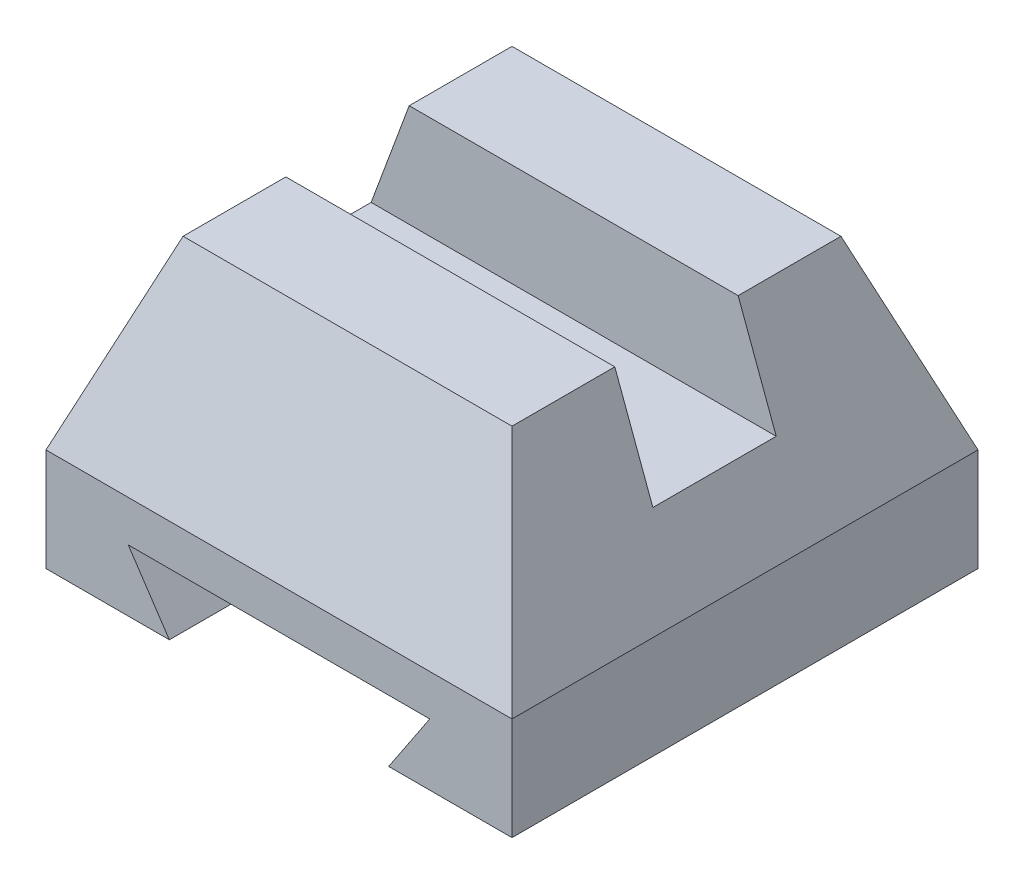
ISO-10303-21;
HEADER;
FILE_DESCRIPTION(('STEP AP214'),'2;1');
FILE_NAME('part.step','',(''),(''),'','','');
FILE_SCHEMA(('AUTOMOTIVE_DESIGN { 1 0 10303 214 1 1 1 1 }'));
ENDSEC;
DATA;
#1=APPLICATION_CONTEXT('core data for automotive mechanical design processes');
#2=APPLICATION_PROTOCOL_DEFINITION('international standard','automotive_design',2000,#1);
#3=PRODUCT_CONTEXT('',#1,'mechanical');
#4=PRODUCT('Part','Part','',(#3));
#5=PRODUCT_RELATED_PRODUCT_CATEGORY('part','',(#4));
#6=PRODUCT_DEFINITION_FORMATION('','',#4);
#7=PRODUCT_DEFINITION_CONTEXT('part definition',#1,'design');
#8=PRODUCT_DEFINITION('design','',#6,#7);
#9=PRODUCT_DEFINITION_SHAPE('','',#8);
#10=(LENGTH_UNIT() NAMED_UNIT(*) SI_UNIT(.MILLI.,.METRE.));
#11=(NAMED_UNIT(*) PLANE_ANGLE_UNIT() SI_UNIT($,.RADIAN.));
#12=(NAMED_UNIT(*) SI_UNIT($,.STERADIAN.) SOLID_ANGLE_UNIT());
#13=UNCERTAINTY_MEASURE_WITH_UNIT(LENGTH_MEASURE(1.E-05),#10,'distance_accuracy_value','');
#14=(GEOMETRIC_REPRESENTATION_CONTEXT(3) GLOBAL_UNCERTAINTY_ASSIGNED_CONTEXT((#13)) GLOBAL_UNIT_ASSIGNED_CONTEXT((#10,
#11,#12)) REPRESENTATION_CONTEXT('',''));
#15=CARTESIAN_POINT('',(0.,0.,0.));
#16=DIRECTION('',(0.,0.,1.));
#17=DIRECTION('',(1.,0.,0.));
#18=AXIS2_PLACEMENT_3D('',#15,#16,#17);
#19=CARTESIAN_POINT('',(34.,-6.,34.));
#20=DIRECTION('',(0.,1.,0.));
#21=DIRECTION('',(-1.,0.,0.));
#22=AXIS2_PLACEMENT_3D('',#19,#20,#21);
#23=PLANE('',#22);
#24=DIRECTION('',(0.,0.,1.));
#25=VECTOR('',#24,1.);
#26=CARTESIAN_POINT('',(-22.,-6.00000000000001,0.));
#27=LINE('',#26,#25);
#28=CARTESIAN_POINT('',(-22.,-6.,-34.));
#29=VERTEX_POINT('',#28);
#30=CARTESIAN_POINT('',(-22.,-6.,34.));
#31=VERTEX_POINT('',#30);
#32=EDGE_CURVE('E323',#29,#31,#27,.T.);
#33=ORIENTED_EDGE('',*,*,#32,.F.);
#34=DIRECTION('',(1.,0.,0.));
#35=VECTOR('',#34,1.);
#36=CARTESIAN_POINT('',(34.,-6.,-34.));
#37=LINE('',#36,#35);
#38=CARTESIAN_POINT('',(22.,-6.,-34.));
#39=VERTEX_POINT('',#38);
#40=EDGE_CURVE('E244',#29,#39,#37,.T.);
#41=ORIENTED_EDGE('',*,*,#40,.T.);
#42=DIRECTION('',(0.,0.,1.));
#43=VECTOR('',#42,1.);
#44=CARTESIAN_POINT('',(22.,-6.00000000000001,0.));
#45=LINE('',#44,#43);
#46=CARTESIAN_POINT('',(22.,-6.,34.));
#47=VERTEX_POINT('',#46);
#48=EDGE_CURVE('E353',#39,#47,#45,.T.);
#49=ORIENTED_EDGE('',*,*,#48,.T.);
#50=DIRECTION('',(1.,0.,0.));
#51=VECTOR('',#50,1.);
#52=CARTESIAN_POINT('',(34.,-6.,34.));
#53=LINE('',#52,#51);
#54=EDGE_CURVE('E352',#31,#47,#53,.T.);
#55=ORIENTED_EDGE('',*,*,#54,.F.);
#56=EDGE_LOOP('',(#33,#41,#49,#55));
#57=FACE_BOUND('',#56,.T.);
#58=ADVANCED_FACE('F47',(#57),#23,.F.);
#59=CARTESIAN_POINT('',(34.,0.,34.));
#60=DIRECTION('',(-1.,0.,0.));
#61=DIRECTION('',(0.,0.,1.));
#62=AXIS2_PLACEMENT_3D('',#59,#60,#61);
#63=PLANE('',#62);
#64=DIRECTION('',(0.,0.,1.));
#65=VECTOR('',#64,1.);
#66=CARTESIAN_POINT('',(34.,-15.,0.));
#67=LINE('',#66,#65);
#68=CARTESIAN_POINT('',(34.,-15.,-34.));
#69=VERTEX_POINT('',#68);
#70=CARTESIAN_POINT('',(34.,-15.,34.));
#71=VERTEX_POINT('',#70);
#72=EDGE_CURVE('E355',#69,#71,#67,.T.);
#73=ORIENTED_EDGE('',*,*,#72,.F.);
#74=DIRECTION('',(0.,1.,0.));
#75=VECTOR('',#74,1.);
#76=CARTESIAN_POINT('',(34.,0.,-34.));
#77=LINE('',#76,#75);
#78=CARTESIAN_POINT('',(34.,0.,-34.));
#79=VERTEX_POINT('',#78);
#80=EDGE_CURVE('E247',#69,#79,#77,.T.);
#81=ORIENTED_EDGE('',*,*,#80,.T.);
#82=DIRECTION('',(0.,0.,1.));
#83=VECTOR('',#82,1.);
#84=CARTESIAN_POINT('',(34.,0.,0.));
#85=LINE('',#84,#83);
#86=CARTESIAN_POINT('',(34.,0.,34.));
#87=VERTEX_POINT('',#86);
#88=EDGE_CURVE('E57',#87,#79,#85,.F.);
#89=ORIENTED_EDGE('',*,*,#88,.F.);
#90=DIRECTION('',(0.,1.,0.));
#91=VECTOR('',#90,1.);
#92=CARTESIAN_POINT('',(34.,0.,34.));
#93=LINE('',#92,#91);
#94=EDGE_CURVE('E354',#71,#87,#93,.T.);
#95=ORIENTED_EDGE('',*,*,#94,.F.);
#96=EDGE_LOOP('',(#73,#81,#89,#95));
#97=FACE_BOUND('',#96,.T.);
#98=ADVANCED_FACE('F435',(#97),#63,.F.);
#99=CARTESIAN_POINT('',(0.,0.,34.));
#100=DIRECTION('',(0.,0.,-1.));
#101=DIRECTION('',(-1.,0.,0.));
#102=AXIS2_PLACEMENT_3D('',#99,#100,#101);
#103=PLANE('',#102);
#104=DIRECTION('',(-1.,0.,0.));
#105=VECTOR('',#104,1.);
#106=CARTESIAN_POINT('',(0.,0.,34.));
#107=LINE('',#106,#105);
#108=CARTESIAN_POINT('',(-34.,0.,34.));
#109=VERTEX_POINT('',#108);
#110=EDGE_CURVE('E86',#87,#109,#107,.T.);
#111=ORIENTED_EDGE('',*,*,#110,.T.);
#112=DIRECTION('',(0.,1.,0.));
#113=VECTOR('',#112,1.);
#114=CARTESIAN_POINT('',(-34.,0.,34.));
#115=LINE('',#114,#113);
#116=CARTESIAN_POINT('',(-34.,-15.,34.));
#117=VERTEX_POINT('',#116);
#118=EDGE_CURVE('E312',#117,#109,#115,.T.);
#119=ORIENTED_EDGE('',*,*,#118,.F.);
#120=DIRECTION('',(-1.,0.,0.));
#121=VECTOR('',#120,1.);
#122=CARTESIAN_POINT('',(-34.,-15.,34.));
#123=LINE('',#122,#121);
#124=CARTESIAN_POINT('',(-16.,-15.,34.));
#125=VERTEX_POINT('',#124);
#126=EDGE_CURVE('E342',#125,#117,#123,.T.);
#127=ORIENTED_EDGE('',*,*,#126,.F.);
#128=DIRECTION('',(0.554700196225229,-0.832050294337844,0.));
#129=VECTOR('',#128,1.);
#130=CARTESIAN_POINT('',(-22.,-6.00000000000001,34.));
#131=LINE('',#130,#129);
#132=EDGE_CURVE('E339',#31,#125,#131,.T.);
#133=ORIENTED_EDGE('',*,*,#132,.F.);
#134=ORIENTED_EDGE('',*,*,#54,.T.);
#135=DIRECTION('',(-0.554700196225229,-0.832050294337844,0.));
#136=VECTOR('',#135,1.);
#137=CARTESIAN_POINT('',(22.,-6.00000000000001,34.));
#138=LINE('',#137,#136);
#139=CARTESIAN_POINT('',(16.,-15.,34.));
#140=VERTEX_POINT('',#139);
#141=EDGE_CURVE('E73',#47,#140,#138,.T.);
#142=ORIENTED_EDGE('',*,*,#141,.T.);
#143=DIRECTION('',(1.,0.,0.));
#144=VECTOR('',#143,1.);
#145=CARTESIAN_POINT('',(34.,-15.,34.));
#146=LINE('',#145,#144);
#147=EDGE_CURVE('E364',#140,#71,#146,.T.);
#148=ORIENTED_EDGE('',*,*,#147,.T.);
#149=ORIENTED_EDGE('',*,*,#94,.T.);
#150=EDGE_LOOP('',(#111,#119,#127,#133,#134,#142,#148,#149));
#151=FACE_BOUND('',#150,.T.);
#152=ADVANCED_FACE('F357',(#151),#103,.F.);
#153=CARTESIAN_POINT('',(34.,-15.,0.));
#154=DIRECTION('',(0.,-1.,0.));
#155=DIRECTION('',(1.,0.,0.));
#156=AXIS2_PLACEMENT_3D('',#153,#154,#155);
#157=PLANE('',#156);
#158=ORIENTED_EDGE('',*,*,#147,.F.);
#159=DIRECTION('',(0.,0.,1.));
#160=VECTOR('',#159,1.);
#161=CARTESIAN_POINT('',(16.,-15.,0.));
#162=LINE('',#161,#160);
#163=CARTESIAN_POINT('',(16.,-15.,-34.));
#164=VERTEX_POINT('',#163);
#165=EDGE_CURVE('E362',#164,#140,#162,.T.);
#166=ORIENTED_EDGE('',*,*,#165,.F.);
#167=DIRECTION('',(1.,0.,0.));
#168=VECTOR('',#167,1.);
#169=CARTESIAN_POINT('',(34.,-15.,-34.));
#170=LINE('',#169,#168);
#171=EDGE_CURVE('E241',#164,#69,#170,.T.);
#172=ORIENTED_EDGE('',*,*,#171,.T.);
#173=ORIENTED_EDGE('',*,*,#72,.T.);
#174=EDGE_LOOP('',(#158,#166,#172,#173));
#175=FACE_BOUND('',#174,.T.);
#176=ADVANCED_FACE('F432',(#175),#157,.T.);
#177=CARTESIAN_POINT('',(22.,-6.00000000000001,0.));
#178=DIRECTION('',(-0.832050294337844,0.554700196225229,0.));
#179=DIRECTION('',(-0.554700196225229,-0.832050294337844,0.));
#180=AXIS2_PLACEMENT_3D('',#177,#178,#179);
#181=PLANE('',#180);
#182=ORIENTED_EDGE('',*,*,#141,.F.);
#183=ORIENTED_EDGE('',*,*,#48,.F.);
#184=DIRECTION('',(-0.554700196225229,-0.832050294337844,0.));
#185=VECTOR('',#184,1.);
#186=CARTESIAN_POINT('',(22.,-6.00000000000001,-34.));
#187=LINE('',#186,#185);
#188=EDGE_CURVE('E233',#39,#164,#187,.T.);
#189=ORIENTED_EDGE('',*,*,#188,.T.);
#190=ORIENTED_EDGE('',*,*,#165,.T.);
#191=EDGE_LOOP('',(#182,#183,#189,#190));
#192=FACE_BOUND('',#191,.T.);
#193=ADVANCED_FACE('F361',(#192),#181,.T.);
#194=CARTESIAN_POINT('',(0.,27.,0.));
#195=DIRECTION('',(0.,1.,0.));
#196=DIRECTION('',(0.,0.,1.));
#197=AXIS2_PLACEMENT_3D('',#194,#195,#196);
#198=PLANE('',#197);
#199=DIRECTION('',(1.,0.,0.));
#200=VECTOR('',#199,1.);
#201=CARTESIAN_POINT('',(0.,27.,24.));
#202=LINE('',#201,#200);
#203=CARTESIAN_POINT('',(0.,27.,24.));
#204=VERTEX_POINT('',#203);
#205=CARTESIAN_POINT('',(24.,27.,24.));
#206=VERTEX_POINT('',#205);
#207=EDGE_CURVE('E384',#204,#206,#202,.T.);
#208=ORIENTED_EDGE('',*,*,#207,.T.);
#209=DIRECTION('',(0.,0.,-1.));
#210=VECTOR('',#209,1.);
#211=CARTESIAN_POINT('',(24.,27.,24.));
#212=LINE('',#211,#210);
#213=CARTESIAN_POINT('',(24.,27.,9.));
#214=VERTEX_POINT('',#213);
#215=EDGE_CURVE('E92',#206,#214,#212,.T.);
#216=ORIENTED_EDGE('',*,*,#215,.T.);
#217=DIRECTION('',(-1.,0.,0.));
#218=VECTOR('',#217,1.);
#219=CARTESIAN_POINT('',(24.,27.,9.));
#220=LINE('',#219,#218);
#221=CARTESIAN_POINT('',(-24.,27.,9.));
#222=VERTEX_POINT('',#221);
#223=EDGE_CURVE('E377',#214,#222,#220,.T.);
#224=ORIENTED_EDGE('',*,*,#223,.T.);
#225=DIRECTION('',(0.,0.,-1.));
#226=VECTOR('',#225,1.);
#227=CARTESIAN_POINT('',(-24.,27.,24.));
#228=LINE('',#227,#226);
#229=CARTESIAN_POINT('',(-24.,27.,24.));
#230=VERTEX_POINT('',#229);
#231=EDGE_CURVE('E329',#230,#222,#228,.T.);
#232=ORIENTED_EDGE('',*,*,#231,.F.);
#233=DIRECTION('',(-1.,0.,0.));
#234=VECTOR('',#233,1.);
#235=CARTESIAN_POINT('',(0.,27.,24.));
#236=LINE('',#235,#234);
#237=EDGE_CURVE('E332',#204,#230,#236,.T.);
#238=ORIENTED_EDGE('',*,*,#237,.F.);
#239=EDGE_LOOP('',(#208,#216,#224,#232,#238));
#240=FACE_BOUND('',#239,.T.);
#241=ADVANCED_FACE('F399',(#240),#198,.T.);
#242=CARTESIAN_POINT('',(0.,11.0735826296743,29.8986731001206));
#243=DIRECTION('',(0.,-0.347314355823594,-0.937748760723704));
#244=DIRECTION('',(0.,0.937748760723704,-0.347314355823594));
#245=AXIS2_PLACEMENT_3D('',#242,#243,#244);
#246=PLANE('',#245);
#247=ORIENTED_EDGE('',*,*,#207,.F.);
#248=ORIENTED_EDGE('',*,*,#237,.T.);
#249=DIRECTION('',(-0.328089357462393,-0.885841265148462,0.328089357462393));
#250=VECTOR('',#249,1.);
#251=CARTESIAN_POINT('',(-24.,27.,24.));
#252=LINE('',#251,#250);
#253=EDGE_CURVE('E309',#230,#109,#252,.T.);
#254=ORIENTED_EDGE('',*,*,#253,.T.);
#255=ORIENTED_EDGE('',*,*,#110,.F.);
#256=DIRECTION('',(0.328089357462393,-0.885841265148462,0.328089357462393));
#257=VECTOR('',#256,1.);
#258=CARTESIAN_POINT('',(24.,27.,24.));
#259=LINE('',#258,#257);
#260=EDGE_CURVE('E379',#206,#87,#259,.T.);
#261=ORIENTED_EDGE('',*,*,#260,.F.);
#262=EDGE_LOOP('',(#247,#248,#254,#255,#261));
#263=FACE_BOUND('',#262,.T.);
#264=ADVANCED_FACE('F409',(#263),#246,.F.);
#265=CARTESIAN_POINT('',(29.8986731001206,11.0735826296743,0.));
#266=DIRECTION('',(0.937748760723704,0.347314355823594,0.));
#267=DIRECTION('',(-0.347314355823594,0.937748760723704,0.));
#268=AXIS2_PLACEMENT_3D('',#265,#266,#267);
#269=PLANE('',#268);
#270=DIRECTION('',(0.347314355823594,-0.937748760723704,0.));
#271=VECTOR('',#270,1.);
#272=CARTESIAN_POINT('',(29.8986731001206,11.0735826296743,9.));
#273=LINE('',#272,#271);
#274=CARTESIAN_POINT('',(29.5555555555556,12.,9.));
#275=VERTEX_POINT('',#274);
#276=EDGE_CURVE('E12',#214,#275,#273,.T.);
#277=ORIENTED_EDGE('',*,*,#276,.F.);
#278=ORIENTED_EDGE('',*,*,#215,.F.);
#279=ORIENTED_EDGE('',*,*,#260,.T.);
#280=ORIENTED_EDGE('',*,*,#88,.T.);
#281=DIRECTION('',(0.328089357462393,-0.885841265148462,-0.328089357462393));
#282=VECTOR('',#281,1.);
#283=CARTESIAN_POINT('',(24.,27.,-24.));
#284=LINE('',#283,#282);
#285=CARTESIAN_POINT('',(24.,27.,-24.));
#286=VERTEX_POINT('',#285);
#287=EDGE_CURVE('E189',#286,#79,#284,.T.);
#288=ORIENTED_EDGE('',*,*,#287,.F.);
#289=DIRECTION('',(0.,0.,1.));
#290=VECTOR('',#289,1.);
#291=CARTESIAN_POINT('',(24.,27.,-24.));
#292=LINE('',#291,#290);
#293=CARTESIAN_POINT('',(24.,27.,-9.));
#294=VERTEX_POINT('',#293);
#295=EDGE_CURVE('E190',#286,#294,#292,.T.);
#296=ORIENTED_EDGE('',*,*,#295,.T.);
#297=DIRECTION('',(0.347314355823594,-0.937748760723704,0.));
#298=VECTOR('',#297,1.);
#299=CARTESIAN_POINT('',(29.8986731001206,11.0735826296743,-9.));
#300=LINE('',#299,#298);
#301=CARTESIAN_POINT('',(29.5555555555556,12.,-9.));
#302=VERTEX_POINT('',#301);
#303=EDGE_CURVE('E185',#294,#302,#300,.T.);
#304=ORIENTED_EDGE('',*,*,#303,.T.);
#305=DIRECTION('',(0.,0.,1.));
#306=VECTOR('',#305,1.);
#307=CARTESIAN_POINT('',(29.5555555555556,12.,-25.));
#308=LINE('',#307,#306);
#309=EDGE_CURVE('E65',#302,#275,#308,.T.);
#310=ORIENTED_EDGE('',*,*,#309,.T.);
#311=EDGE_LOOP('',(#277,#278,#279,#280,#288,#296,#304,#310));
#312=FACE_BOUND('',#311,.T.);
#313=ADVANCED_FACE('F436',(#312),#269,.T.);
#314=CARTESIAN_POINT('',(34.,0.,9.));
#315=DIRECTION('',(0.,0.,1.));
#316=DIRECTION('',(1.,0.,0.));
#317=AXIS2_PLACEMENT_3D('',#314,#315,#316);
#318=PLANE('',#317);
#319=ORIENTED_EDGE('',*,*,#276,.T.);
#320=DIRECTION('',(-1.,0.,0.));
#321=VECTOR('',#320,1.);
#322=CARTESIAN_POINT('',(34.,12.,9.));
#323=LINE('',#322,#321);
#324=CARTESIAN_POINT('',(-29.5555555555556,12.,9.));
#325=VERTEX_POINT('',#324);
#326=EDGE_CURVE('E453',#275,#325,#323,.T.);
#327=ORIENTED_EDGE('',*,*,#326,.T.);
#328=DIRECTION('',(-0.347314355823594,-0.937748760723704,0.));
#329=VECTOR('',#328,1.);
#330=CARTESIAN_POINT('',(-29.8986731001206,11.0735826296743,9.));
#331=LINE('',#330,#329);
#332=EDGE_CURVE('E311',#222,#325,#331,.T.);
#333=ORIENTED_EDGE('',*,*,#332,.F.);
#334=ORIENTED_EDGE('',*,*,#223,.F.);
#335=EDGE_LOOP('',(#319,#327,#333,#334));
#336=FACE_BOUND('',#335,.T.);
#337=ADVANCED_FACE('F410',(#336),#318,.F.);
#338=CARTESIAN_POINT('',(34.,12.,0.));
#339=DIRECTION('',(0.,1.,0.));
#340=DIRECTION('',(0.,0.,1.));
#341=AXIS2_PLACEMENT_3D('',#338,#339,#340);
#342=PLANE('',#341);
#343=ORIENTED_EDGE('',*,*,#309,.F.);
#344=DIRECTION('',(-1.,0.,0.));
#345=VECTOR('',#344,1.);
#346=CARTESIAN_POINT('',(34.,12.,-9.));
#347=LINE('',#346,#345);
#348=CARTESIAN_POINT('',(-29.5555555555556,12.,-9.));
#349=VERTEX_POINT('',#348);
#350=EDGE_CURVE('E179',#302,#349,#347,.T.);
#351=ORIENTED_EDGE('',*,*,#350,.T.);
#352=DIRECTION('',(0.,0.,1.));
#353=VECTOR('',#352,1.);
#354=CARTESIAN_POINT('',(-29.5555555555556,12.,-25.));
#355=LINE('',#354,#353);
#356=EDGE_CURVE('E175',#349,#325,#355,.T.);
#357=ORIENTED_EDGE('',*,*,#356,.T.);
#358=ORIENTED_EDGE('',*,*,#326,.F.);
#359=EDGE_LOOP('',(#343,#351,#357,#358));
#360=FACE_BOUND('',#359,.T.);
#361=ADVANCED_FACE('F500',(#360),#342,.T.);
#362=CARTESIAN_POINT('',(-34.,0.,34.));
#363=DIRECTION('',(1.,0.,0.));
#364=DIRECTION('',(0.,0.,1.));
#365=AXIS2_PLACEMENT_3D('',#362,#363,#364);
#366=PLANE('',#365);
#367=DIRECTION('',(0.,0.,1.));
#368=VECTOR('',#367,1.);
#369=CARTESIAN_POINT('',(-34.,0.,0.));
#370=LINE('',#369,#368);
#371=CARTESIAN_POINT('',(-34.,0.,-34.));
#372=VERTEX_POINT('',#371);
#373=EDGE_CURVE('E306',#109,#372,#370,.F.);
#374=ORIENTED_EDGE('',*,*,#373,.T.);
#375=DIRECTION('',(0.,1.,0.));
#376=VECTOR('',#375,1.);
#377=CARTESIAN_POINT('',(-34.,0.,-34.));
#378=LINE('',#377,#376);
#379=CARTESIAN_POINT('',(-34.,-15.,-34.));
#380=VERTEX_POINT('',#379);
#381=EDGE_CURVE('E180',#380,#372,#378,.T.);
#382=ORIENTED_EDGE('',*,*,#381,.F.);
#383=DIRECTION('',(0.,0.,1.));
#384=VECTOR('',#383,1.);
#385=CARTESIAN_POINT('',(-34.,-15.,0.));
#386=LINE('',#385,#384);
#387=EDGE_CURVE('E316',#380,#117,#386,.T.);
#388=ORIENTED_EDGE('',*,*,#387,.T.);
#389=ORIENTED_EDGE('',*,*,#118,.T.);
#390=EDGE_LOOP('',(#374,#382,#388,#389));
#391=FACE_BOUND('',#390,.T.);
#392=ADVANCED_FACE('F315',(#391),#366,.F.);
#393=CARTESIAN_POINT('',(-34.,-15.,0.));
#394=DIRECTION('',(0.,-1.,0.));
#395=DIRECTION('',(-1.,0.,0.));
#396=AXIS2_PLACEMENT_3D('',#393,#394,#395);
#397=PLANE('',#396);
#398=ORIENTED_EDGE('',*,*,#126,.T.);
#399=ORIENTED_EDGE('',*,*,#387,.F.);
#400=DIRECTION('',(-1.,0.,0.));
#401=VECTOR('',#400,1.);
#402=CARTESIAN_POINT('',(-34.,-15.,-34.));
#403=LINE('',#402,#401);
#404=CARTESIAN_POINT('',(-16.,-15.,-34.));
#405=VERTEX_POINT('',#404);
#406=EDGE_CURVE('E293',#405,#380,#403,.T.);
#407=ORIENTED_EDGE('',*,*,#406,.F.);
#408=DIRECTION('',(0.,0.,1.));
#409=VECTOR('',#408,1.);
#410=CARTESIAN_POINT('',(-16.,-15.,0.));
#411=LINE('',#410,#409);
#412=EDGE_CURVE('E320',#405,#125,#411,.T.);
#413=ORIENTED_EDGE('',*,*,#412,.T.);
#414=EDGE_LOOP('',(#398,#399,#407,#413));
#415=FACE_BOUND('',#414,.T.);
#416=ADVANCED_FACE('F358',(#415),#397,.T.);
#417=CARTESIAN_POINT('',(-22.,-6.00000000000001,0.));
#418=DIRECTION('',(0.832050294337844,0.554700196225229,0.));
#419=DIRECTION('',(0.554700196225229,-0.832050294337844,0.));
#420=AXIS2_PLACEMENT_3D('',#417,#418,#419);
#421=PLANE('',#420);
#422=ORIENTED_EDGE('',*,*,#132,.T.);
#423=ORIENTED_EDGE('',*,*,#412,.F.);
#424=DIRECTION('',(0.554700196225229,-0.832050294337844,0.));
#425=VECTOR('',#424,1.);
#426=CARTESIAN_POINT('',(-22.,-6.00000000000001,-34.));
#427=LINE('',#426,#425);
#428=EDGE_CURVE('E290',#29,#405,#427,.T.);
#429=ORIENTED_EDGE('',*,*,#428,.F.);
#430=ORIENTED_EDGE('',*,*,#32,.T.);
#431=EDGE_LOOP('',(#422,#423,#429,#430));
#432=FACE_BOUND('',#431,.T.);
#433=ADVANCED_FACE('F347',(#432),#421,.T.);
#434=CARTESIAN_POINT('',(-29.8986731001206,11.0735826296743,0.));
#435=DIRECTION('',(-0.937748760723704,0.347314355823594,0.));
#436=DIRECTION('',(0.347314355823594,0.937748760723704,0.));
#437=AXIS2_PLACEMENT_3D('',#434,#435,#436);
#438=PLANE('',#437);
#439=ORIENTED_EDGE('',*,*,#332,.T.);
#440=ORIENTED_EDGE('',*,*,#356,.F.);
#441=DIRECTION('',(-0.347314355823594,-0.937748760723704,0.));
#442=VECTOR('',#441,1.);
#443=CARTESIAN_POINT('',(-29.8986731001206,11.0735826296743,-9.));
#444=LINE('',#443,#442);
#445=CARTESIAN_POINT('',(-24.,27.,-9.));
#446=VERTEX_POINT('',#445);
#447=EDGE_CURVE('E165',#446,#349,#444,.T.);
#448=ORIENTED_EDGE('',*,*,#447,.F.);
#449=DIRECTION('',(0.,0.,1.));
#450=VECTOR('',#449,1.);
#451=CARTESIAN_POINT('',(-24.,27.,-24.));
#452=LINE('',#451,#450);
#453=CARTESIAN_POINT('',(-24.,27.,-24.));
#454=VERTEX_POINT('',#453);
#455=EDGE_CURVE('E171',#454,#446,#452,.T.);
#456=ORIENTED_EDGE('',*,*,#455,.F.);
#457=DIRECTION('',(-0.328089357462393,-0.885841265148462,-0.328089357462393));
#458=VECTOR('',#457,1.);
#459=CARTESIAN_POINT('',(-24.,27.,-24.));
#460=LINE('',#459,#458);
#461=EDGE_CURVE('E197',#454,#372,#460,.T.);
#462=ORIENTED_EDGE('',*,*,#461,.T.);
#463=ORIENTED_EDGE('',*,*,#373,.F.);
#464=ORIENTED_EDGE('',*,*,#253,.F.);
#465=ORIENTED_EDGE('',*,*,#231,.T.);
#466=EDGE_LOOP('',(#439,#440,#448,#456,#462,#463,#464,#465));
#467=FACE_BOUND('',#466,.T.);
#468=ADVANCED_FACE('F168',(#467),#438,.T.);
#469=CARTESIAN_POINT('',(0.,0.,-34.));
#470=DIRECTION('',(0.,0.,1.));
#471=DIRECTION('',(-1.,0.,0.));
#472=AXIS2_PLACEMENT_3D('',#469,#470,#471);
#473=PLANE('',#472);
#474=DIRECTION('',(-1.,0.,0.));
#475=VECTOR('',#474,1.);
#476=CARTESIAN_POINT('',(0.,0.,-34.));
#477=LINE('',#476,#475);
#478=EDGE_CURVE('E250',#79,#372,#477,.T.);
#479=ORIENTED_EDGE('',*,*,#478,.F.);
#480=ORIENTED_EDGE('',*,*,#80,.F.);
#481=ORIENTED_EDGE('',*,*,#171,.F.);
#482=ORIENTED_EDGE('',*,*,#188,.F.);
#483=ORIENTED_EDGE('',*,*,#40,.F.);
#484=ORIENTED_EDGE('',*,*,#428,.T.);
#485=ORIENTED_EDGE('',*,*,#406,.T.);
#486=ORIENTED_EDGE('',*,*,#381,.T.);
#487=EDGE_LOOP('',(#479,#480,#481,#482,#483,#484,#485,#486));
#488=FACE_BOUND('',#487,.T.);
#489=ADVANCED_FACE('F218',(#488),#473,.F.);
#490=CARTESIAN_POINT('',(0.,27.,0.));
#491=DIRECTION('',(0.,1.,0.));
#492=DIRECTION('',(0.,0.,-1.));
#493=AXIS2_PLACEMENT_3D('',#490,#491,#492);
#494=PLANE('',#493);
#495=DIRECTION('',(1.,0.,0.));
#496=VECTOR('',#495,1.);
#497=CARTESIAN_POINT('',(0.,27.,-24.));
#498=LINE('',#497,#496);
#499=CARTESIAN_POINT('',(0.,27.,-24.));
#500=VERTEX_POINT('',#499);
#501=EDGE_CURVE('E260',#500,#286,#498,.T.);
#502=ORIENTED_EDGE('',*,*,#501,.F.);
#503=DIRECTION('',(-1.,0.,0.));
#504=VECTOR('',#503,1.);
#505=CARTESIAN_POINT('',(0.,27.,-24.));
#506=LINE('',#505,#504);
#507=EDGE_CURVE('E195',#500,#454,#506,.T.);
#508=ORIENTED_EDGE('',*,*,#507,.T.);
#509=ORIENTED_EDGE('',*,*,#455,.T.);
#510=DIRECTION('',(-1.,0.,0.));
#511=VECTOR('',#510,1.);
#512=CARTESIAN_POINT('',(24.,27.,-9.));
#513=LINE('',#512,#511);
#514=EDGE_CURVE('E183',#294,#446,#513,.T.);
#515=ORIENTED_EDGE('',*,*,#514,.F.);
#516=ORIENTED_EDGE('',*,*,#295,.F.);
#517=EDGE_LOOP('',(#502,#508,#509,#515,#516));
#518=FACE_BOUND('',#517,.T.);
#519=ADVANCED_FACE('F194',(#518),#494,.T.);
#520=CARTESIAN_POINT('',(0.,11.0735826296743,-29.8986731001206));
#521=DIRECTION('',(0.,-0.347314355823594,0.937748760723704));
#522=DIRECTION('',(0.,0.937748760723704,0.347314355823594));
#523=AXIS2_PLACEMENT_3D('',#520,#521,#522);
#524=PLANE('',#523);
#525=ORIENTED_EDGE('',*,*,#501,.T.);
#526=ORIENTED_EDGE('',*,*,#287,.T.);
#527=ORIENTED_EDGE('',*,*,#478,.T.);
#528=ORIENTED_EDGE('',*,*,#461,.F.);
#529=ORIENTED_EDGE('',*,*,#507,.F.);
#530=EDGE_LOOP('',(#525,#526,#527,#528,#529));
#531=FACE_BOUND('',#530,.T.);
#532=ADVANCED_FACE('F217',(#531),#524,.F.);
#533=CARTESIAN_POINT('',(34.,0.,-9.));
#534=DIRECTION('',(0.,0.,-1.));
#535=DIRECTION('',(1.,0.,0.));
#536=AXIS2_PLACEMENT_3D('',#533,#534,#535);
#537=PLANE('',#536);
#538=ORIENTED_EDGE('',*,*,#303,.F.);
#539=ORIENTED_EDGE('',*,*,#514,.T.);
#540=ORIENTED_EDGE('',*,*,#447,.T.);
#541=ORIENTED_EDGE('',*,*,#350,.F.);
#542=EDGE_LOOP('',(#538,#539,#540,#541));
#543=FACE_BOUND('',#542,.T.);
#544=ADVANCED_FACE('F184',(#543),#537,.F.);
#545=CLOSED_SHELL('',(#58,#98,#152,#176,#193,#241,#264,#313,#337,#361,#392,#416,#433,#468,#489,
#519,#532,#544));
#546=MANIFOLD_SOLID_BREP('B2',#545);
#547=ADVANCED_BREP_SHAPE_REPRESENTATION('',(#18,#546),#14);
#548=SHAPE_DEFINITION_REPRESENTATION(#9,#547);
ENDSEC;
END-ISO-10303-21;
